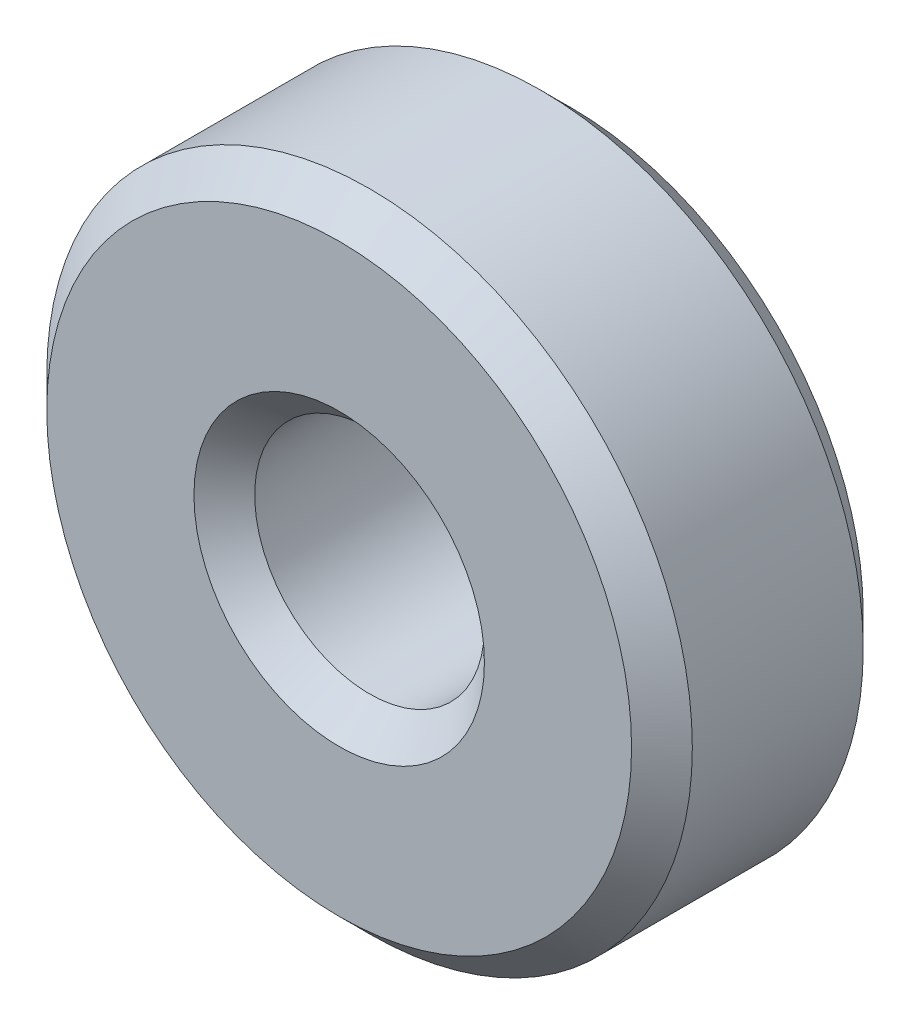
ISO-10303-21;
HEADER;
FILE_DESCRIPTION(('STEP AP214'),'2;1');
FILE_NAME('part.step','',(''),(''),'','','');
FILE_SCHEMA(('AUTOMOTIVE_DESIGN { 1 0 10303 214 1 1 1 1 }'));
ENDSEC;
DATA;
#1=APPLICATION_CONTEXT('core data for automotive mechanical design processes');
#2=APPLICATION_PROTOCOL_DEFINITION('international standard','automotive_design',2000,#1);
#3=PRODUCT_CONTEXT('',#1,'mechanical');
#4=PRODUCT('Part','Part','',(#3));
#5=PRODUCT_RELATED_PRODUCT_CATEGORY('part','',(#4));
#6=PRODUCT_DEFINITION_FORMATION('','',#4);
#7=PRODUCT_DEFINITION_CONTEXT('part definition',#1,'design');
#8=PRODUCT_DEFINITION('design','',#6,#7);
#9=PRODUCT_DEFINITION_SHAPE('','',#8);
#10=(LENGTH_UNIT() NAMED_UNIT(*) SI_UNIT(.MILLI.,.METRE.));
#11=(NAMED_UNIT(*) PLANE_ANGLE_UNIT() SI_UNIT($,.RADIAN.));
#12=(NAMED_UNIT(*) SI_UNIT($,.STERADIAN.) SOLID_ANGLE_UNIT());
#13=UNCERTAINTY_MEASURE_WITH_UNIT(LENGTH_MEASURE(1.E-05),#10,'distance_accuracy_value','');
#14=(GEOMETRIC_REPRESENTATION_CONTEXT(3) GLOBAL_UNCERTAINTY_ASSIGNED_CONTEXT((#13)) GLOBAL_UNIT_ASSIGNED_CONTEXT((#10,
#11,#12)) REPRESENTATION_CONTEXT('',''));
#15=CARTESIAN_POINT('',(0.,0.,0.));
#16=DIRECTION('',(0.,0.,1.));
#17=DIRECTION('',(1.,0.,0.));
#18=AXIS2_PLACEMENT_3D('',#15,#16,#17);
#19=CARTESIAN_POINT('',(0.,0.,3.05));
#20=DIRECTION('',(0.,0.,1.));
#21=DIRECTION('',(1.,0.,0.));
#22=AXIS2_PLACEMENT_3D('',#19,#20,#21);
#23=PLANE('',#22);
#24=CARTESIAN_POINT('',(0.,0.,3.05));
#25=DIRECTION('',(0.,0.,1.));
#26=DIRECTION('',(1.,0.,0.));
#27=AXIS2_PLACEMENT_3D('',#24,#25,#26);
#28=CIRCLE('',#27,3.825);
#29=CARTESIAN_POINT('',(3.825,0.,3.05));
#30=VERTEX_POINT('',#29);
#31=EDGE_CURVE('E45',#30,#30,#28,.F.);
#32=ORIENTED_EDGE('',*,*,#31,.T.);
#33=EDGE_LOOP('',(#32));
#34=FACE_BOUND('',#33,.T.);
#35=CARTESIAN_POINT('',(0.,0.,3.05));
#36=DIRECTION('',(0.,0.,1.));
#37=DIRECTION('',(1.,0.,0.));
#38=AXIS2_PLACEMENT_3D('',#35,#36,#37);
#39=CIRCLE('',#38,7.70000000000001);
#40=CARTESIAN_POINT('',(7.70000000000001,0.,3.05));
#41=VERTEX_POINT('',#40);
#42=EDGE_CURVE('E49',#41,#41,#39,.T.);
#43=ORIENTED_EDGE('',*,*,#42,.T.);
#44=EDGE_LOOP('',(#43));
#45=FACE_BOUND('',#44,.T.);
#46=ADVANCED_FACE('F33',(#34,#45),#23,.T.);
#47=CARTESIAN_POINT('',(0.,0.,-3.05));
#48=DIRECTION('',(0.,0.,1.));
#49=DIRECTION('',(1.,0.,0.));
#50=AXIS2_PLACEMENT_3D('',#47,#48,#49);
#51=PLANE('',#50);
#52=CARTESIAN_POINT('',(0.,0.,-3.05));
#53=DIRECTION('',(0.,0.,1.));
#54=DIRECTION('',(1.,0.,0.));
#55=AXIS2_PLACEMENT_3D('',#52,#53,#54);
#56=CIRCLE('',#55,3.825);
#57=CARTESIAN_POINT('',(3.825,0.,-3.05));
#58=VERTEX_POINT('',#57);
#59=EDGE_CURVE('E60',#58,#58,#56,.T.);
#60=ORIENTED_EDGE('',*,*,#59,.T.);
#61=EDGE_LOOP('',(#60));
#62=FACE_BOUND('',#61,.T.);
#63=CARTESIAN_POINT('',(0.,0.,-3.05));
#64=DIRECTION('',(0.,0.,1.));
#65=DIRECTION('',(1.,0.,0.));
#66=AXIS2_PLACEMENT_3D('',#63,#64,#65);
#67=CIRCLE('',#66,7.7);
#68=CARTESIAN_POINT('',(7.7,0.,-3.05));
#69=VERTEX_POINT('',#68);
#70=EDGE_CURVE('E63',#69,#69,#67,.F.);
#71=ORIENTED_EDGE('',*,*,#70,.T.);
#72=EDGE_LOOP('',(#71));
#73=FACE_BOUND('',#72,.T.);
#74=ADVANCED_FACE('F67',(#62,#73),#51,.F.);
#75=CARTESIAN_POINT('',(0.,0.,3.05));
#76=DIRECTION('',(0.,0.,-1.));
#77=DIRECTION('',(-1.,0.,0.));
#78=AXIS2_PLACEMENT_3D('',#75,#76,#77);
#79=CYLINDRICAL_SURFACE('',#78,8.5);
#80=CARTESIAN_POINT('',(0.,0.,-2.25));
#81=DIRECTION('',(0.,0.,1.));
#82=DIRECTION('',(1.,0.,0.));
#83=AXIS2_PLACEMENT_3D('',#80,#81,#82);
#84=CIRCLE('',#83,8.5);
#85=CARTESIAN_POINT('',(8.5,0.,-2.25));
#86=VERTEX_POINT('',#85);
#87=EDGE_CURVE('E10',#86,#86,#84,.T.);
#88=ORIENTED_EDGE('',*,*,#87,.T.);
#89=EDGE_LOOP('',(#88));
#90=FACE_BOUND('',#89,.T.);
#91=CARTESIAN_POINT('',(0.,0.,2.25));
#92=DIRECTION('',(0.,0.,1.));
#93=DIRECTION('',(1.,0.,0.));
#94=AXIS2_PLACEMENT_3D('',#91,#92,#93);
#95=CIRCLE('',#94,8.5);
#96=CARTESIAN_POINT('',(8.5,0.,2.25));
#97=VERTEX_POINT('',#96);
#98=EDGE_CURVE('E41',#97,#97,#95,.F.);
#99=ORIENTED_EDGE('',*,*,#98,.T.);
#100=EDGE_LOOP('',(#99));
#101=FACE_BOUND('',#100,.T.);
#102=ADVANCED_FACE('F88',(#90,#101),#79,.T.);
#103=CARTESIAN_POINT('',(0.,0.,3.05));
#104=DIRECTION('',(0.,0.,-1.));
#105=DIRECTION('',(-1.,0.,0.));
#106=AXIS2_PLACEMENT_3D('',#103,#104,#105);
#107=CYLINDRICAL_SURFACE('',#106,3.025);
#108=CARTESIAN_POINT('',(0.,0.,-2.25));
#109=DIRECTION('',(0.,0.,1.));
#110=DIRECTION('',(1.,0.,0.));
#111=AXIS2_PLACEMENT_3D('',#108,#109,#110);
#112=CIRCLE('',#111,3.025);
#113=CARTESIAN_POINT('',(3.025,0.,-2.25));
#114=VERTEX_POINT('',#113);
#115=EDGE_CURVE('E54',#114,#114,#112,.F.);
#116=ORIENTED_EDGE('',*,*,#115,.T.);
#117=EDGE_LOOP('',(#116));
#118=FACE_BOUND('',#117,.T.);
#119=CARTESIAN_POINT('',(0.,0.,2.25000000000001));
#120=DIRECTION('',(0.,0.,1.));
#121=DIRECTION('',(1.,0.,0.));
#122=AXIS2_PLACEMENT_3D('',#119,#120,#121);
#123=CIRCLE('',#122,3.025);
#124=CARTESIAN_POINT('',(3.025,0.,2.25000000000001));
#125=VERTEX_POINT('',#124);
#126=EDGE_CURVE('E57',#125,#125,#123,.T.);
#127=ORIENTED_EDGE('',*,*,#126,.T.);
#128=EDGE_LOOP('',(#127));
#129=FACE_BOUND('',#128,.T.);
#130=ADVANCED_FACE('F93',(#118,#129),#107,.F.);
#131=CARTESIAN_POINT('',(0.,0.,-3.05));
#132=DIRECTION('',(0.,0.,-1.));
#133=DIRECTION('',(-1.,0.,0.));
#134=AXIS2_PLACEMENT_3D('',#131,#132,#133);
#135=CONICAL_SURFACE('',#134,3.825,0.785398163397448);
#136=ORIENTED_EDGE('',*,*,#115,.F.);
#137=EDGE_LOOP('',(#136));
#138=FACE_BOUND('',#137,.T.);
#139=ORIENTED_EDGE('',*,*,#59,.F.);
#140=EDGE_LOOP('',(#139));
#141=FACE_BOUND('',#140,.T.);
#142=ADVANCED_FACE('F78',(#138,#141),#135,.F.);
#143=CARTESIAN_POINT('',(0.,0.,2.25000000000001));
#144=DIRECTION('',(0.,0.,1.));
#145=DIRECTION('',(1.,0.,0.));
#146=AXIS2_PLACEMENT_3D('',#143,#144,#145);
#147=CONICAL_SURFACE('',#146,3.025,0.785398163397451);
#148=ORIENTED_EDGE('',*,*,#31,.F.);
#149=EDGE_LOOP('',(#148));
#150=FACE_BOUND('',#149,.T.);
#151=ORIENTED_EDGE('',*,*,#126,.F.);
#152=EDGE_LOOP('',(#151));
#153=FACE_BOUND('',#152,.T.);
#154=ADVANCED_FACE('F72',(#150,#153),#147,.F.);
#155=CARTESIAN_POINT('',(0.,0.,-2.25));
#156=DIRECTION('',(0.,0.,1.));
#157=DIRECTION('',(1.,0.,0.));
#158=AXIS2_PLACEMENT_3D('',#155,#156,#157);
#159=CONICAL_SURFACE('',#158,8.5,0.785398163397449);
#160=CARTESIAN_POINT('',(7.7,0.,-3.05));
#161=CARTESIAN_POINT('',(7.70833333333333,0.,-3.04166666666667));
#162=CARTESIAN_POINT('',(7.71666666666667,0.,-3.03333333333333));
#163=CARTESIAN_POINT('',(7.73333333333333,0.,-3.01666666666667));
#164=CARTESIAN_POINT('',(7.74166666666667,0.,-3.00833333333333));
#165=CARTESIAN_POINT('',(7.75833333333333,0.,-2.99166666666667));
#166=CARTESIAN_POINT('',(7.76666666666667,0.,-2.98333333333333));
#167=CARTESIAN_POINT('',(7.78333333333333,0.,-2.96666666666667));
#168=CARTESIAN_POINT('',(7.79166666666667,0.,-2.95833333333333));
#169=CARTESIAN_POINT('',(7.80833333333333,0.,-2.94166666666667));
#170=CARTESIAN_POINT('',(7.81666666666667,0.,-2.93333333333333));
#171=CARTESIAN_POINT('',(7.83333333333333,0.,-2.91666666666667));
#172=CARTESIAN_POINT('',(7.84166666666667,0.,-2.90833333333333));
#173=CARTESIAN_POINT('',(7.85833333333333,0.,-2.89166666666667));
#174=CARTESIAN_POINT('',(7.86666666666667,0.,-2.88333333333333));
#175=CARTESIAN_POINT('',(7.88333333333333,0.,-2.86666666666667));
#176=CARTESIAN_POINT('',(7.89166666666667,0.,-2.85833333333333));
#177=CARTESIAN_POINT('',(7.90833333333333,0.,-2.84166666666667));
#178=CARTESIAN_POINT('',(7.91666666666667,0.,-2.83333333333333));
#179=CARTESIAN_POINT('',(7.93333333333333,0.,-2.81666666666667));
#180=CARTESIAN_POINT('',(7.94166666666667,0.,-2.80833333333333));
#181=CARTESIAN_POINT('',(7.95833333333333,0.,-2.79166666666667));
#182=CARTESIAN_POINT('',(7.96666666666667,0.,-2.78333333333333));
#183=CARTESIAN_POINT('',(7.98333333333333,0.,-2.76666666666667));
#184=CARTESIAN_POINT('',(7.99166666666667,0.,-2.75833333333333));
#185=CARTESIAN_POINT('',(8.00833333333333,0.,-2.74166666666667));
#186=CARTESIAN_POINT('',(8.01666666666667,0.,-2.73333333333333));
#187=CARTESIAN_POINT('',(8.03333333333333,0.,-2.71666666666667));
#188=CARTESIAN_POINT('',(8.04166666666667,0.,-2.70833333333333));
#189=CARTESIAN_POINT('',(8.05833333333333,0.,-2.69166666666667));
#190=CARTESIAN_POINT('',(8.06666666666667,0.,-2.68333333333333));
#191=CARTESIAN_POINT('',(8.08333333333333,0.,-2.66666666666667));
#192=CARTESIAN_POINT('',(8.09166666666667,0.,-2.65833333333333));
#193=CARTESIAN_POINT('',(8.10833333333333,0.,-2.64166666666667));
#194=CARTESIAN_POINT('',(8.11666666666667,0.,-2.63333333333333));
#195=CARTESIAN_POINT('',(8.13333333333333,0.,-2.61666666666667));
#196=CARTESIAN_POINT('',(8.14166666666667,0.,-2.60833333333333));
#197=CARTESIAN_POINT('',(8.15833333333333,0.,-2.59166666666667));
#198=CARTESIAN_POINT('',(8.16666666666667,0.,-2.58333333333333));
#199=CARTESIAN_POINT('',(8.18333333333333,0.,-2.56666666666667));
#200=CARTESIAN_POINT('',(8.19166666666667,0.,-2.55833333333333));
#201=CARTESIAN_POINT('',(8.20833333333333,0.,-2.54166666666667));
#202=CARTESIAN_POINT('',(8.21666666666667,0.,-2.53333333333333));
#203=CARTESIAN_POINT('',(8.23333333333333,0.,-2.51666666666667));
#204=CARTESIAN_POINT('',(8.24166666666667,0.,-2.50833333333333));
#205=CARTESIAN_POINT('',(8.25833333333333,0.,-2.49166666666667));
#206=CARTESIAN_POINT('',(8.26666666666667,0.,-2.48333333333333));
#207=CARTESIAN_POINT('',(8.28333333333333,0.,-2.46666666666667));
#208=CARTESIAN_POINT('',(8.29166666666667,0.,-2.45833333333333));
#209=CARTESIAN_POINT('',(8.30833333333333,0.,-2.44166666666667));
#210=CARTESIAN_POINT('',(8.31666666666667,0.,-2.43333333333333));
#211=CARTESIAN_POINT('',(8.33333333333333,0.,-2.41666666666667));
#212=CARTESIAN_POINT('',(8.34166666666667,0.,-2.40833333333333));
#213=CARTESIAN_POINT('',(8.35833333333333,0.,-2.39166666666667));
#214=CARTESIAN_POINT('',(8.36666666666667,0.,-2.38333333333333));
#215=CARTESIAN_POINT('',(8.38333333333333,0.,-2.36666666666667));
#216=CARTESIAN_POINT('',(8.39166666666667,0.,-2.35833333333333));
#217=CARTESIAN_POINT('',(8.40833333333333,0.,-2.34166666666667));
#218=CARTESIAN_POINT('',(8.41666666666667,0.,-2.33333333333333));
#219=CARTESIAN_POINT('',(8.43333333333333,0.,-2.31666666666667));
#220=CARTESIAN_POINT('',(8.44166666666667,0.,-2.30833333333333));
#221=CARTESIAN_POINT('',(8.45833333333333,0.,-2.29166666666667));
#222=CARTESIAN_POINT('',(8.46666666666667,0.,-2.28333333333333));
#223=CARTESIAN_POINT('',(8.48333333333333,0.,-2.26666666666667));
#224=CARTESIAN_POINT('',(8.49166666666667,0.,-2.25833333333333));
#225=CARTESIAN_POINT('',(8.5,0.,-2.25));
#226=B_SPLINE_CURVE_WITH_KNOTS('',3,(#160,#161,#162,#163,#164,#165,#166,#167,#168,#169,#170,
#171,#172,#173,#174,#175,#176,#177,#178,#179,#180,#181,#182,#183,#184,#185,#186,#187,#188,#189,
#190,#191,#192,#193,#194,#195,#196,#197,#198,#199,#200,#201,#202,#203,#204,#205,#206,#207,#208,
#209,#210,#211,#212,#213,#214,#215,#216,#217,#218,#219,#220,#221,#222,#223,#224,#225),
.UNSPECIFIED.,.F.,.F.,(4,2,2,2,2,2,2,2,2,2,2,2,2,2,2,2,2,2,2,2,2,2,2,2,2,2,2,2,2,2,2,2,4),(0.,
0.0353553390593275,0.0707106781186546,0.106066017177982,0.141421356237309,0.176776695296637,
0.212132034355964,0.247487373415291,0.282842712474619,0.318198051533946,0.353553390593274,
0.3889087296526,0.424264068711928,0.459619407771256,0.494974746830583,0.53033008588991,
0.565685424949237,0.601040764008565,0.636396103067893,0.671751442127219,0.707106781186547,
0.742462120245874,0.777817459305202,0.813172798364528,0.848528137423856,0.883883476483184,
0.919238815542511,0.954594154601838,0.989949493661167,1.02530483272049,1.06066017177982,
1.09601551083915,1.13137084989848),.UNSPECIFIED.);
#227=EDGE_CURVE('BSEAM69',#69,#86,#226,.T.);
#228=ORIENTED_EDGE('',*,*,#70,.F.);
#229=ORIENTED_EDGE('',*,*,#87,.F.);
#230=ORIENTED_EDGE('',*,*,#227,.T.);
#231=ORIENTED_EDGE('',*,*,#227,.F.);
#232=EDGE_LOOP('',(#228,#230,#229,#231));
#233=FACE_BOUND('',#232,.T.);
#234=ADVANCED_FACE('F69',(#233),#159,.T.);
#235=CARTESIAN_POINT('',(0.,0.,3.05));
#236=DIRECTION('',(0.,0.,-1.));
#237=DIRECTION('',(-1.,0.,0.));
#238=AXIS2_PLACEMENT_3D('',#235,#236,#237);
#239=CONICAL_SURFACE('',#238,7.70000000000001,0.785398163397446);
#240=ORIENTED_EDGE('',*,*,#98,.F.);
#241=EDGE_LOOP('',(#240));
#242=FACE_BOUND('',#241,.T.);
#243=ORIENTED_EDGE('',*,*,#42,.F.);
#244=EDGE_LOOP('',(#243));
#245=FACE_BOUND('',#244,.T.);
#246=ADVANCED_FACE('F36',(#242,#245),#239,.T.);
#247=CLOSED_SHELL('',(#46,#74,#102,#130,#142,#154,#234,#246));
#248=MANIFOLD_SOLID_BREP('B2',#247);
#249=ADVANCED_BREP_SHAPE_REPRESENTATION('',(#18,#248),#14);
#250=SHAPE_DEFINITION_REPRESENTATION(#9,#249);
ENDSEC;
END-ISO-10303-21;
